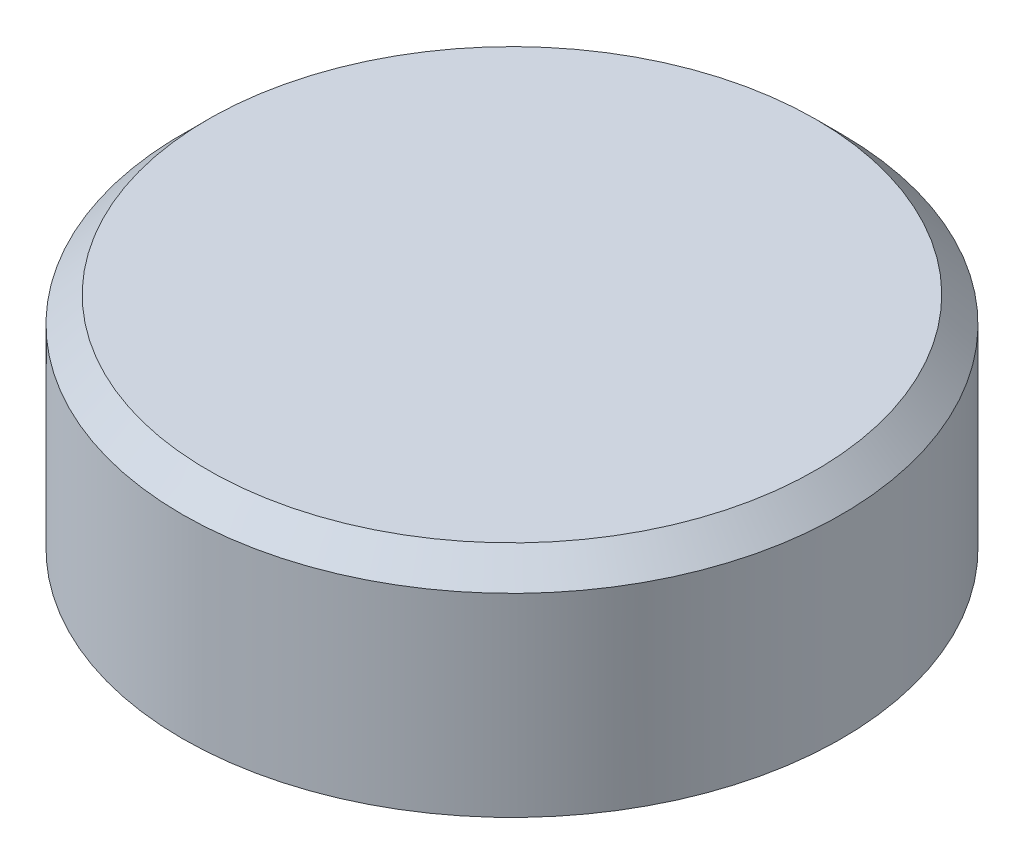
ISO-10303-21;
HEADER;
FILE_DESCRIPTION(('STEP AP214'),'2;1');
FILE_NAME('part.step','',(''),(''),'','','');
FILE_SCHEMA(('AUTOMOTIVE_DESIGN { 1 0 10303 214 1 1 1 1 }'));
ENDSEC;
DATA;
#1=APPLICATION_CONTEXT('core data for automotive mechanical design processes');
#2=APPLICATION_PROTOCOL_DEFINITION('international standard','automotive_design',2000,#1);
#3=PRODUCT_CONTEXT('',#1,'mechanical');
#4=PRODUCT('Part','Part','',(#3));
#5=PRODUCT_RELATED_PRODUCT_CATEGORY('part','',(#4));
#6=PRODUCT_DEFINITION_FORMATION('','',#4);
#7=PRODUCT_DEFINITION_CONTEXT('part definition',#1,'design');
#8=PRODUCT_DEFINITION('design','',#6,#7);
#9=PRODUCT_DEFINITION_SHAPE('','',#8);
#10=(LENGTH_UNIT() NAMED_UNIT(*) SI_UNIT(.MILLI.,.METRE.));
#11=(NAMED_UNIT(*) PLANE_ANGLE_UNIT() SI_UNIT($,.RADIAN.));
#12=(NAMED_UNIT(*) SI_UNIT($,.STERADIAN.) SOLID_ANGLE_UNIT());
#13=UNCERTAINTY_MEASURE_WITH_UNIT(LENGTH_MEASURE(1.E-05),#10,'distance_accuracy_value','');
#14=(GEOMETRIC_REPRESENTATION_CONTEXT(3) GLOBAL_UNCERTAINTY_ASSIGNED_CONTEXT((#13)) GLOBAL_UNIT_ASSIGNED_CONTEXT((#10,
#11,#12)) REPRESENTATION_CONTEXT('',''));
#15=CARTESIAN_POINT('',(0.,0.,0.));
#16=DIRECTION('',(0.,0.,1.));
#17=DIRECTION('',(1.,0.,0.));
#18=AXIS2_PLACEMENT_3D('',#15,#16,#17);
#19=CARTESIAN_POINT('',(2.49999994412065,2.,0.699999984353781));
#20=DIRECTION('',(0.,1.,0.));
#21=DIRECTION('',(0.,0.,1.));
#22=AXIS2_PLACEMENT_3D('',#19,#20,#21);
#23=PLANE('',#22);
#24=CARTESIAN_POINT('',(2.49999994412065,1.99999999995271,0.699999984353781));
#25=DIRECTION('',(0.,-1.,0.));
#26=DIRECTION('',(0.,0.,-1.));
#27=AXIS2_PLACEMENT_3D('',#24,#25,#26);
#28=CIRCLE('',#27,0.830000000007662);
#29=CARTESIAN_POINT('',(2.49999994412065,1.99999999995271,-0.130000015653881));
#30=VERTEX_POINT('',#29);
#31=EDGE_CURVE('E18',#30,#30,#28,.T.);
#32=ORIENTED_EDGE('',*,*,#31,.F.);
#33=EDGE_LOOP('',(#32));
#34=FACE_BOUND('',#33,.T.);
#35=ADVANCED_FACE('F15',(#34),#23,.T.);
#36=CARTESIAN_POINT('',(2.49999994412065,1.92999999995891,0.699999984353781));
#37=DIRECTION('',(0.,-1.,0.));
#38=DIRECTION('',(0.,0.,-1.));
#39=AXIS2_PLACEMENT_3D('',#36,#37,#38);
#40=CONICAL_SURFACE('',#39,0.899999999944616,0.785398162991424);
#41=CARTESIAN_POINT('',(2.49999994412065,1.93,0.699999984353781));
#42=DIRECTION('',(0.,1.,0.));
#43=DIRECTION('',(0.,0.,1.));
#44=AXIS2_PLACEMENT_3D('',#41,#42,#43);
#45=CIRCLE('',#44,0.9);
#46=CARTESIAN_POINT('',(2.49999994412065,1.93,1.59999998435378));
#47=VERTEX_POINT('',#46);
#48=EDGE_CURVE('E22',#47,#47,#45,.F.);
#49=ORIENTED_EDGE('',*,*,#48,.F.);
#50=EDGE_LOOP('',(#49));
#51=FACE_BOUND('',#50,.T.);
#52=ORIENTED_EDGE('',*,*,#31,.T.);
#53=EDGE_LOOP('',(#52));
#54=FACE_BOUND('',#53,.T.);
#55=ADVANCED_FACE('F32',(#51,#54),#40,.T.);
#56=CARTESIAN_POINT('',(2.49999994412065,1.4,0.699999984353781));
#57=DIRECTION('',(0.,1.,0.));
#58=DIRECTION('',(0.,0.,1.));
#59=AXIS2_PLACEMENT_3D('',#56,#57,#58);
#60=CYLINDRICAL_SURFACE('',#59,0.9);
#61=CARTESIAN_POINT('',(2.49999994412065,1.4,0.699999984353781));
#62=DIRECTION('',(0.,1.,0.));
#63=DIRECTION('',(0.,0.,1.));
#64=AXIS2_PLACEMENT_3D('',#61,#62,#63);
#65=CIRCLE('',#64,0.9);
#66=CARTESIAN_POINT('',(2.49999994412065,1.4,1.59999998435378));
#67=VERTEX_POINT('',#66);
#68=EDGE_CURVE('E10',#67,#67,#65,.T.);
#69=ORIENTED_EDGE('',*,*,#68,.T.);
#70=EDGE_LOOP('',(#69));
#71=FACE_BOUND('',#70,.T.);
#72=ORIENTED_EDGE('',*,*,#48,.T.);
#73=EDGE_LOOP('',(#72));
#74=FACE_BOUND('',#73,.T.);
#75=ADVANCED_FACE('F39',(#71,#74),#60,.T.);
#76=CARTESIAN_POINT('',(2.5,1.4,0.714662247631483));
#77=DIRECTION('',(0.,1.,0.));
#78=DIRECTION('',(0.,0.,1.));
#79=AXIS2_PLACEMENT_3D('',#76,#77,#78);
#80=PLANE('',#79);
#81=ORIENTED_EDGE('',*,*,#68,.F.);
#82=EDGE_LOOP('',(#81));
#83=FACE_BOUND('',#82,.T.);
#84=ADVANCED_FACE('F41',(#83),#80,.F.);
#85=CLOSED_SHELL('',(#35,#55,#75,#84));
#86=MANIFOLD_SOLID_BREP('B1',#85);
#87=ADVANCED_BREP_SHAPE_REPRESENTATION('',(#18,#86),#14);
#88=SHAPE_DEFINITION_REPRESENTATION(#9,#87);
ENDSEC;
END-ISO-10303-21;
